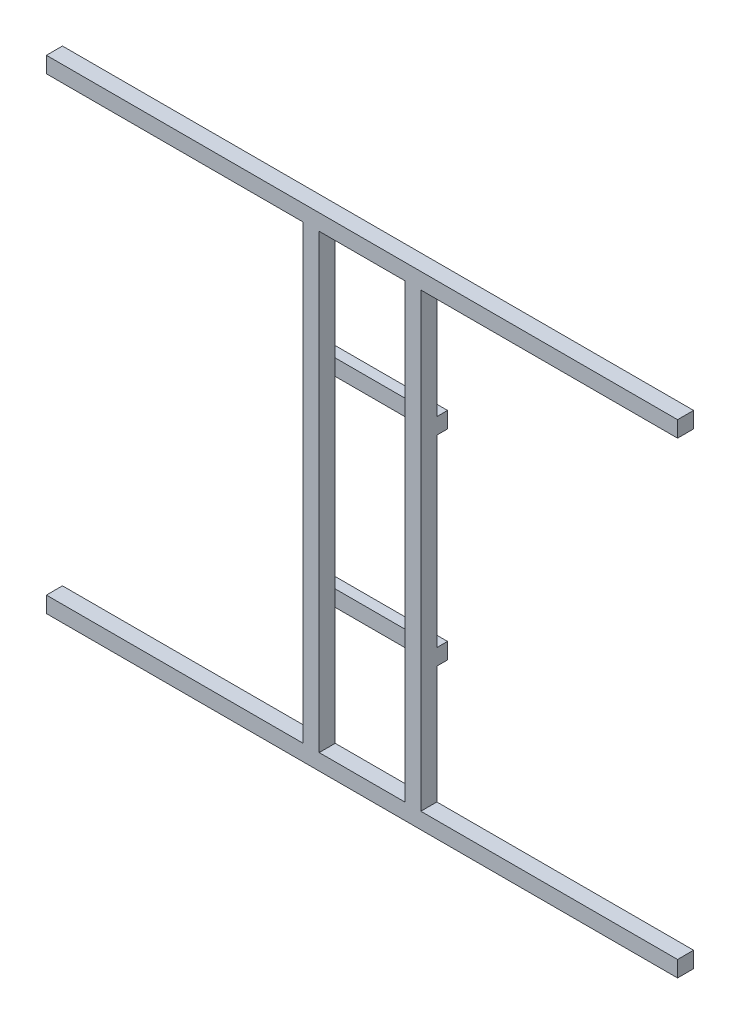
ISO-10303-21;
HEADER;
FILE_DESCRIPTION(('STEP AP214'),'2;1');
FILE_NAME('part.step','',(''),(''),'','','');
FILE_SCHEMA(('AUTOMOTIVE_DESIGN { 1 0 10303 214 1 1 1 1 }'));
ENDSEC;
DATA;
#1=APPLICATION_CONTEXT('core data for automotive mechanical design processes');
#2=APPLICATION_PROTOCOL_DEFINITION('international standard','automotive_design',2000,#1);
#3=PRODUCT_CONTEXT('',#1,'mechanical');
#4=PRODUCT('Part','Part','',(#3));
#5=PRODUCT_RELATED_PRODUCT_CATEGORY('part','',(#4));
#6=PRODUCT_DEFINITION_FORMATION('','',#4);
#7=PRODUCT_DEFINITION_CONTEXT('part definition',#1,'design');
#8=PRODUCT_DEFINITION('design','',#6,#7);
#9=PRODUCT_DEFINITION_SHAPE('','',#8);
#10=(LENGTH_UNIT() NAMED_UNIT(*) SI_UNIT(.MILLI.,.METRE.));
#11=(NAMED_UNIT(*) PLANE_ANGLE_UNIT() SI_UNIT($,.RADIAN.));
#12=(NAMED_UNIT(*) SI_UNIT($,.STERADIAN.) SOLID_ANGLE_UNIT());
#13=UNCERTAINTY_MEASURE_WITH_UNIT(LENGTH_MEASURE(1.E-05),#10,'distance_accuracy_value','');
#14=(GEOMETRIC_REPRESENTATION_CONTEXT(3) GLOBAL_UNCERTAINTY_ASSIGNED_CONTEXT((#13)) GLOBAL_UNIT_ASSIGNED_CONTEXT((#10,
#11,#12)) REPRESENTATION_CONTEXT('',''));
#15=CARTESIAN_POINT('',(0.,0.,0.));
#16=DIRECTION('',(0.,0.,1.));
#17=DIRECTION('',(1.,0.,0.));
#18=AXIS2_PLACEMENT_3D('',#15,#16,#17);
#19=CARTESIAN_POINT('',(0.,0.,10.));
#20=DIRECTION('',(0.,0.,-1.));
#21=DIRECTION('',(-1.,0.,0.));
#22=AXIS2_PLACEMENT_3D('',#19,#20,#21);
#23=PLANE('',#22);
#24=DIRECTION('',(0.,-1.,0.));
#25=VECTOR('',#24,1.);
#26=CARTESIAN_POINT('',(-54.9999999999967,-210.999923245137,10.));
#27=LINE('',#26,#25);
#28=CARTESIAN_POINT('',(-54.9999999999967,-100.999923245137,10.));
#29=VERTEX_POINT('',#28);
#30=CARTESIAN_POINT('',(-54.9999999999967,-210.999923245137,10.));
#31=VERTEX_POINT('',#30);
#32=EDGE_CURVE('E339',#29,#31,#27,.T.);
#33=ORIENTED_EDGE('',*,*,#32,.F.);
#34=DIRECTION('',(1.,0.,0.));
#35=VECTOR('',#34,1.);
#36=CARTESIAN_POINT('',(54.9999999999963,-100.999923245137,10.));
#37=LINE('',#36,#35);
#38=CARTESIAN_POINT('',(-39.9999999999966,-100.999923245137,10.));
#39=VERTEX_POINT('',#38);
#40=EDGE_CURVE('E427',#29,#39,#37,.T.);
#41=ORIENTED_EDGE('',*,*,#40,.T.);
#42=DIRECTION('',(0.,-1.,0.));
#43=VECTOR('',#42,1.);
#44=CARTESIAN_POINT('',(-39.9999999999967,-210.999923245137,10.));
#45=LINE('',#44,#43);
#46=CARTESIAN_POINT('',(-39.9999999999967,-210.999923245137,10.));
#47=VERTEX_POINT('',#46);
#48=EDGE_CURVE('E277',#39,#47,#45,.T.);
#49=ORIENTED_EDGE('',*,*,#48,.T.);
#50=DIRECTION('',(1.,0.,0.));
#51=VECTOR('',#50,1.);
#52=CARTESIAN_POINT('',(-39.9999999999967,-210.999923245137,10.));
#53=LINE('',#52,#51);
#54=CARTESIAN_POINT('',(39.9999999999963,-210.999923245137,10.));
#55=VERTEX_POINT('',#54);
#56=EDGE_CURVE('E281',#47,#55,#53,.T.);
#57=ORIENTED_EDGE('',*,*,#56,.T.);
#58=DIRECTION('',(0.,1.,0.));
#59=VECTOR('',#58,1.);
#60=CARTESIAN_POINT('',(39.9999999999963,-210.999923245137,10.));
#61=LINE('',#60,#59);
#62=CARTESIAN_POINT('',(39.9999999999963,-100.999923245137,10.));
#63=VERTEX_POINT('',#62);
#64=EDGE_CURVE('E46',#55,#63,#61,.T.);
#65=ORIENTED_EDGE('',*,*,#64,.T.);
#66=CARTESIAN_POINT('',(54.9999999999963,-100.999923245137,10.));
#67=VERTEX_POINT('',#66);
#68=EDGE_CURVE('E62',#63,#67,#37,.T.);
#69=ORIENTED_EDGE('',*,*,#68,.T.);
#70=DIRECTION('',(0.,1.,0.));
#71=VECTOR('',#70,1.);
#72=CARTESIAN_POINT('',(54.9999999999963,-210.999923245137,10.));
#73=LINE('',#72,#71);
#74=CARTESIAN_POINT('',(54.9999999999963,-210.999923245137,10.));
#75=VERTEX_POINT('',#74);
#76=EDGE_CURVE('E240',#75,#67,#73,.T.);
#77=ORIENTED_EDGE('',*,*,#76,.F.);
#78=DIRECTION('',(-1.,0.,0.));
#79=VECTOR('',#78,1.);
#80=CARTESIAN_POINT('',(54.9999999999963,-210.999923245137,10.));
#81=LINE('',#80,#79);
#82=CARTESIAN_POINT('',(294.999999999996,-210.999923245137,10.));
#83=VERTEX_POINT('',#82);
#84=EDGE_CURVE('E297',#83,#75,#81,.T.);
#85=ORIENTED_EDGE('',*,*,#84,.F.);
#86=DIRECTION('',(0.,1.,0.));
#87=VECTOR('',#86,1.);
#88=CARTESIAN_POINT('',(294.999999999996,-210.999923245137,10.));
#89=LINE('',#88,#87);
#90=CARTESIAN_POINT('',(294.999999999996,-225.999923245137,10.));
#91=VERTEX_POINT('',#90);
#92=EDGE_CURVE('E302',#91,#83,#89,.T.);
#93=ORIENTED_EDGE('',*,*,#92,.F.);
#94=DIRECTION('',(1.,0.,0.));
#95=VECTOR('',#94,1.);
#96=CARTESIAN_POINT('',(-295.000000000004,-225.999923245137,10.));
#97=LINE('',#96,#95);
#98=CARTESIAN_POINT('',(-295.000000000004,-225.999923245137,10.));
#99=VERTEX_POINT('',#98);
#100=EDGE_CURVE('E348',#99,#91,#97,.T.);
#101=ORIENTED_EDGE('',*,*,#100,.F.);
#102=DIRECTION('',(0.,-1.,0.));
#103=VECTOR('',#102,1.);
#104=CARTESIAN_POINT('',(-295.000000000004,-210.999923245137,10.));
#105=LINE('',#104,#103);
#106=CARTESIAN_POINT('',(-295.000000000004,-210.999923245137,10.));
#107=VERTEX_POINT('',#106);
#108=EDGE_CURVE('E346',#107,#99,#105,.T.);
#109=ORIENTED_EDGE('',*,*,#108,.F.);
#110=DIRECTION('',(-1.,0.,0.));
#111=VECTOR('',#110,1.);
#112=CARTESIAN_POINT('',(-295.000000000004,-210.999923245137,10.));
#113=LINE('',#112,#111);
#114=EDGE_CURVE('E343',#31,#107,#113,.T.);
#115=ORIENTED_EDGE('',*,*,#114,.F.);
#116=EDGE_LOOP('',(#33,#41,#49,#57,#65,#69,#77,#85,#93,#101,#109,#115));
#117=FACE_BOUND('',#116,.T.);
#118=ADVANCED_FACE('F35',(#117),#23,.T.);
#119=CARTESIAN_POINT('',(54.9999999999963,-85.9999232451367,10.));
#120=VERTEX_POINT('',#119);
#121=CARTESIAN_POINT('',(54.9999999999963,85.9999232451366,10.));
#122=VERTEX_POINT('',#121);
#123=EDGE_CURVE('E54',#120,#122,#73,.T.);
#124=ORIENTED_EDGE('',*,*,#123,.F.);
#125=DIRECTION('',(-1.,0.,0.));
#126=VECTOR('',#125,1.);
#127=CARTESIAN_POINT('',(54.9999999999963,-85.9999232451367,10.));
#128=LINE('',#127,#126);
#129=CARTESIAN_POINT('',(39.9999999999963,-85.9999232451367,10.));
#130=VERTEX_POINT('',#129);
#131=EDGE_CURVE('E252',#120,#130,#128,.T.);
#132=ORIENTED_EDGE('',*,*,#131,.T.);
#133=CARTESIAN_POINT('',(39.9999999999963,85.9999232451364,10.));
#134=VERTEX_POINT('',#133);
#135=EDGE_CURVE('E286',#130,#134,#61,.T.);
#136=ORIENTED_EDGE('',*,*,#135,.T.);
#137=DIRECTION('',(1.,0.,0.));
#138=VECTOR('',#137,1.);
#139=CARTESIAN_POINT('',(54.9999999999963,85.9999232451367,10.));
#140=LINE('',#139,#138);
#141=EDGE_CURVE('E389',#134,#122,#140,.T.);
#142=ORIENTED_EDGE('',*,*,#141,.T.);
#143=EDGE_LOOP('',(#124,#132,#136,#142));
#144=FACE_BOUND('',#143,.T.);
#145=ADVANCED_FACE('F453',(#144),#23,.T.);
#146=CARTESIAN_POINT('',(-39.9999999999966,85.9999232451367,10.));
#147=VERTEX_POINT('',#146);
#148=CARTESIAN_POINT('',(-39.9999999999967,-85.9999232451367,10.));
#149=VERTEX_POINT('',#148);
#150=EDGE_CURVE('E282',#147,#149,#45,.T.);
#151=ORIENTED_EDGE('',*,*,#150,.T.);
#152=CARTESIAN_POINT('',(-54.9999999999967,-85.9999232451367,10.));
#153=VERTEX_POINT('',#152);
#154=EDGE_CURVE('E449',#149,#153,#128,.T.);
#155=ORIENTED_EDGE('',*,*,#154,.T.);
#156=CARTESIAN_POINT('',(-54.9999999999967,85.9999232451366,10.));
#157=VERTEX_POINT('',#156);
#158=EDGE_CURVE('E344',#157,#153,#27,.T.);
#159=ORIENTED_EDGE('',*,*,#158,.F.);
#160=EDGE_CURVE('E392',#157,#147,#140,.T.);
#161=ORIENTED_EDGE('',*,*,#160,.T.);
#162=EDGE_LOOP('',(#151,#155,#159,#161));
#163=FACE_BOUND('',#162,.T.);
#164=ADVANCED_FACE('F505',(#163),#23,.T.);
#165=CARTESIAN_POINT('',(54.9999999999963,100.999923245137,10.));
#166=DIRECTION('',(-1.,0.,0.));
#167=DIRECTION('',(0.,0.,1.));
#168=AXIS2_PLACEMENT_3D('',#165,#166,#167);
#169=PLANE('',#168);
#170=DIRECTION('',(0.,1.,0.));
#171=VECTOR('',#170,1.);
#172=CARTESIAN_POINT('',(54.9999999999963,100.999923245137,0.));
#173=LINE('',#172,#171);
#174=CARTESIAN_POINT('',(54.9999999999963,85.9999232451367,0.));
#175=VERTEX_POINT('',#174);
#176=CARTESIAN_POINT('',(54.9999999999963,100.999923245137,0.));
#177=VERTEX_POINT('',#176);
#178=EDGE_CURVE('E385',#175,#177,#173,.T.);
#179=ORIENTED_EDGE('',*,*,#178,.T.);
#180=DIRECTION('',(0.,0.,-1.));
#181=VECTOR('',#180,1.);
#182=CARTESIAN_POINT('',(54.9999999999963,100.999923245137,10.));
#183=LINE('',#182,#181);
#184=CARTESIAN_POINT('',(54.9999999999963,100.999923245137,10.));
#185=VERTEX_POINT('',#184);
#186=EDGE_CURVE('E39',#185,#177,#183,.T.);
#187=ORIENTED_EDGE('',*,*,#186,.F.);
#188=CARTESIAN_POINT('',(54.9999999999963,210.999923245137,10.));
#189=VERTEX_POINT('',#188);
#190=EDGE_CURVE('E327',#185,#189,#73,.T.);
#191=ORIENTED_EDGE('',*,*,#190,.T.);
#192=DIRECTION('',(0.,0.,-1.));
#193=VECTOR('',#192,1.);
#194=CARTESIAN_POINT('',(54.9999999999963,210.999923245137,25.));
#195=LINE('',#194,#193);
#196=CARTESIAN_POINT('',(54.9999999999963,210.999923245137,25.));
#197=VERTEX_POINT('',#196);
#198=EDGE_CURVE('E380',#197,#189,#195,.T.);
#199=ORIENTED_EDGE('',*,*,#198,.F.);
#200=DIRECTION('',(0.,1.,0.));
#201=VECTOR('',#200,1.);
#202=CARTESIAN_POINT('',(54.9999999999963,-210.999923245137,25.));
#203=LINE('',#202,#201);
#204=CARTESIAN_POINT('',(54.9999999999963,-210.999923245137,25.));
#205=VERTEX_POINT('',#204);
#206=EDGE_CURVE('E301',#205,#197,#203,.T.);
#207=ORIENTED_EDGE('',*,*,#206,.F.);
#208=DIRECTION('',(0.,0.,-1.));
#209=VECTOR('',#208,1.);
#210=CARTESIAN_POINT('',(54.9999999999963,-210.999923245137,25.));
#211=LINE('',#210,#209);
#212=EDGE_CURVE('E383',#205,#75,#211,.T.);
#213=ORIENTED_EDGE('',*,*,#212,.T.);
#214=ORIENTED_EDGE('',*,*,#76,.T.);
#215=DIRECTION('',(0.,0.,-1.));
#216=VECTOR('',#215,1.);
#217=CARTESIAN_POINT('',(54.9999999999963,-100.999923245137,10.));
#218=LINE('',#217,#216);
#219=CARTESIAN_POINT('',(54.9999999999963,-100.999923245137,0.));
#220=VERTEX_POINT('',#219);
#221=EDGE_CURVE('E237',#67,#220,#218,.T.);
#222=ORIENTED_EDGE('',*,*,#221,.T.);
#223=DIRECTION('',(0.,1.,0.));
#224=VECTOR('',#223,1.);
#225=CARTESIAN_POINT('',(54.9999999999963,-100.999923245137,0.));
#226=LINE('',#225,#224);
#227=CARTESIAN_POINT('',(54.9999999999963,-85.9999232451367,0.));
#228=VERTEX_POINT('',#227);
#229=EDGE_CURVE('E226',#220,#228,#226,.T.);
#230=ORIENTED_EDGE('',*,*,#229,.T.);
#231=DIRECTION('',(0.,0.,-1.));
#232=VECTOR('',#231,1.);
#233=CARTESIAN_POINT('',(54.9999999999963,-85.9999232451367,10.));
#234=LINE('',#233,#232);
#235=EDGE_CURVE('E243',#120,#228,#234,.T.);
#236=ORIENTED_EDGE('',*,*,#235,.F.);
#237=ORIENTED_EDGE('',*,*,#123,.T.);
#238=DIRECTION('',(0.,0.,-1.));
#239=VECTOR('',#238,1.);
#240=CARTESIAN_POINT('',(54.9999999999963,85.9999232451367,10.));
#241=LINE('',#240,#239);
#242=EDGE_CURVE('E395',#122,#175,#241,.T.);
#243=ORIENTED_EDGE('',*,*,#242,.T.);
#244=EDGE_LOOP('',(#179,#187,#191,#199,#207,#213,#214,#222,#230,#236,#237,#243));
#245=FACE_BOUND('',#244,.T.);
#246=ADVANCED_FACE('F37',(#245),#169,.F.);
#247=CARTESIAN_POINT('',(54.9999999999963,100.999923245137,10.));
#248=DIRECTION('',(0.,-1.,0.));
#249=DIRECTION('',(1.,0.,0.));
#250=AXIS2_PLACEMENT_3D('',#247,#248,#249);
#251=PLANE('',#250);
#252=DIRECTION('',(-1.,0.,0.));
#253=VECTOR('',#252,1.);
#254=CARTESIAN_POINT('',(54.9999999999963,100.999923245137,0.));
#255=LINE('',#254,#253);
#256=CARTESIAN_POINT('',(-54.9999999999966,100.999923245137,0.));
#257=VERTEX_POINT('',#256);
#258=EDGE_CURVE('E398',#177,#257,#255,.T.);
#259=ORIENTED_EDGE('',*,*,#258,.T.);
#260=DIRECTION('',(0.,0.,-1.));
#261=VECTOR('',#260,1.);
#262=CARTESIAN_POINT('',(-54.9999999999966,100.999923245137,10.));
#263=LINE('',#262,#261);
#264=CARTESIAN_POINT('',(-54.9999999999967,100.999923245137,10.));
#265=VERTEX_POINT('',#264);
#266=EDGE_CURVE('E408',#265,#257,#263,.T.);
#267=ORIENTED_EDGE('',*,*,#266,.F.);
#268=DIRECTION('',(-1.,0.,0.));
#269=VECTOR('',#268,1.);
#270=CARTESIAN_POINT('',(54.9999999999963,100.999923245137,10.));
#271=LINE('',#270,#269);
#272=CARTESIAN_POINT('',(-39.9999999999967,100.999923245136,10.));
#273=VERTEX_POINT('',#272);
#274=EDGE_CURVE('E391',#273,#265,#271,.T.);
#275=ORIENTED_EDGE('',*,*,#274,.F.);
#276=CARTESIAN_POINT('',(39.9999999999963,100.999923245137,10.));
#277=VERTEX_POINT('',#276);
#278=EDGE_CURVE('E390',#277,#273,#271,.T.);
#279=ORIENTED_EDGE('',*,*,#278,.F.);
#280=EDGE_CURVE('E386',#185,#277,#271,.T.);
#281=ORIENTED_EDGE('',*,*,#280,.F.);
#282=ORIENTED_EDGE('',*,*,#186,.T.);
#283=EDGE_LOOP('',(#259,#267,#275,#279,#281,#282));
#284=FACE_BOUND('',#283,.T.);
#285=ADVANCED_FACE('F495',(#284),#251,.F.);
#286=CARTESIAN_POINT('',(-54.9999999999966,100.999923245137,10.));
#287=DIRECTION('',(1.,0.,0.));
#288=DIRECTION('',(0.,0.,-1.));
#289=AXIS2_PLACEMENT_3D('',#286,#287,#288);
#290=PLANE('',#289);
#291=DIRECTION('',(0.,-1.,0.));
#292=VECTOR('',#291,1.);
#293=CARTESIAN_POINT('',(-54.9999999999966,100.999923245137,0.));
#294=LINE('',#293,#292);
#295=CARTESIAN_POINT('',(-54.9999999999966,85.9999232451367,0.));
#296=VERTEX_POINT('',#295);
#297=EDGE_CURVE('E400',#257,#296,#294,.T.);
#298=ORIENTED_EDGE('',*,*,#297,.T.);
#299=DIRECTION('',(0.,0.,-1.));
#300=VECTOR('',#299,1.);
#301=CARTESIAN_POINT('',(-54.9999999999966,85.9999232451367,10.));
#302=LINE('',#301,#300);
#303=EDGE_CURVE('E406',#157,#296,#302,.T.);
#304=ORIENTED_EDGE('',*,*,#303,.F.);
#305=ORIENTED_EDGE('',*,*,#158,.T.);
#306=DIRECTION('',(0.,0.,-1.));
#307=VECTOR('',#306,1.);
#308=CARTESIAN_POINT('',(-54.9999999999967,-85.9999232451366,10.));
#309=LINE('',#308,#307);
#310=CARTESIAN_POINT('',(-54.9999999999967,-85.9999232451366,0.));
#311=VERTEX_POINT('',#310);
#312=EDGE_CURVE('E259',#153,#311,#309,.T.);
#313=ORIENTED_EDGE('',*,*,#312,.T.);
#314=DIRECTION('',(0.,-1.,0.));
#315=VECTOR('',#314,1.);
#316=CARTESIAN_POINT('',(-54.9999999999967,-100.999923245137,0.));
#317=LINE('',#316,#315);
#318=CARTESIAN_POINT('',(-54.9999999999967,-100.999923245137,0.));
#319=VERTEX_POINT('',#318);
#320=EDGE_CURVE('E256',#311,#319,#317,.T.);
#321=ORIENTED_EDGE('',*,*,#320,.T.);
#322=DIRECTION('',(0.,0.,-1.));
#323=VECTOR('',#322,1.);
#324=CARTESIAN_POINT('',(-54.9999999999967,-100.999923245137,10.));
#325=LINE('',#324,#323);
#326=EDGE_CURVE('E249',#29,#319,#325,.T.);
#327=ORIENTED_EDGE('',*,*,#326,.F.);
#328=ORIENTED_EDGE('',*,*,#32,.T.);
#329=DIRECTION('',(0.,0.,-1.));
#330=VECTOR('',#329,1.);
#331=CARTESIAN_POINT('',(-54.9999999999967,-210.999923245137,25.));
#332=LINE('',#331,#330);
#333=CARTESIAN_POINT('',(-54.9999999999967,-210.999923245137,25.));
#334=VERTEX_POINT('',#333);
#335=EDGE_CURVE('E362',#334,#31,#332,.T.);
#336=ORIENTED_EDGE('',*,*,#335,.F.);
#337=DIRECTION('',(0.,-1.,0.));
#338=VECTOR('',#337,1.);
#339=CARTESIAN_POINT('',(-54.9999999999967,-210.999923245137,25.));
#340=LINE('',#339,#338);
#341=CARTESIAN_POINT('',(-54.9999999999967,210.999923245137,25.));
#342=VERTEX_POINT('',#341);
#343=EDGE_CURVE('E314',#342,#334,#340,.T.);
#344=ORIENTED_EDGE('',*,*,#343,.F.);
#345=DIRECTION('',(0.,0.,-1.));
#346=VECTOR('',#345,1.);
#347=CARTESIAN_POINT('',(-54.9999999999967,210.999923245137,25.));
#348=LINE('',#347,#346);
#349=CARTESIAN_POINT('',(-54.9999999999967,210.999923245137,10.));
#350=VERTEX_POINT('',#349);
#351=EDGE_CURVE('E365',#342,#350,#348,.T.);
#352=ORIENTED_EDGE('',*,*,#351,.T.);
#353=EDGE_CURVE('E340',#350,#265,#27,.T.);
#354=ORIENTED_EDGE('',*,*,#353,.T.);
#355=ORIENTED_EDGE('',*,*,#266,.T.);
#356=EDGE_LOOP('',(#298,#304,#305,#313,#321,#327,#328,#336,#344,#352,#354,#355));
#357=FACE_BOUND('',#356,.T.);
#358=ADVANCED_FACE('F458',(#357),#290,.F.);
#359=CARTESIAN_POINT('',(54.9999999999963,85.9999232451367,10.));
#360=DIRECTION('',(0.,1.,0.));
#361=DIRECTION('',(-1.,0.,0.));
#362=AXIS2_PLACEMENT_3D('',#359,#360,#361);
#363=PLANE('',#362);
#364=DIRECTION('',(1.,0.,0.));
#365=VECTOR('',#364,1.);
#366=CARTESIAN_POINT('',(54.9999999999963,85.9999232451367,0.));
#367=LINE('',#366,#365);
#368=EDGE_CURVE('E402',#296,#175,#367,.T.);
#369=ORIENTED_EDGE('',*,*,#368,.T.);
#370=ORIENTED_EDGE('',*,*,#242,.F.);
#371=ORIENTED_EDGE('',*,*,#141,.F.);
#372=EDGE_CURVE('E396',#147,#134,#140,.T.);
#373=ORIENTED_EDGE('',*,*,#372,.F.);
#374=ORIENTED_EDGE('',*,*,#160,.F.);
#375=ORIENTED_EDGE('',*,*,#303,.T.);
#376=EDGE_LOOP('',(#369,#370,#371,#373,#374,#375));
#377=FACE_BOUND('',#376,.T.);
#378=ADVANCED_FACE('F503',(#377),#363,.F.);
#379=CARTESIAN_POINT('',(0.,0.,10.));
#380=DIRECTION('',(0.,0.,-1.));
#381=DIRECTION('',(-1.,0.,0.));
#382=AXIS2_PLACEMENT_3D('',#379,#380,#381);
#383=PLANE('',#382);
#384=ORIENTED_EDGE('',*,*,#372,.T.);
#385=EDGE_CURVE('E11',#134,#277,#61,.T.);
#386=ORIENTED_EDGE('',*,*,#385,.T.);
#387=ORIENTED_EDGE('',*,*,#278,.T.);
#388=EDGE_CURVE('E44',#273,#147,#45,.T.);
#389=ORIENTED_EDGE('',*,*,#388,.T.);
#390=EDGE_LOOP('',(#384,#386,#387,#389));
#391=FACE_BOUND('',#390,.T.);
#392=ADVANCED_FACE('F494',(#391),#383,.F.);
#393=CARTESIAN_POINT('',(0.,0.,0.));
#394=DIRECTION('',(0.,0.,-1.));
#395=DIRECTION('',(-1.,0.,0.));
#396=AXIS2_PLACEMENT_3D('',#393,#394,#395);
#397=PLANE('',#396);
#398=ORIENTED_EDGE('',*,*,#178,.F.);
#399=ORIENTED_EDGE('',*,*,#368,.F.);
#400=ORIENTED_EDGE('',*,*,#297,.F.);
#401=ORIENTED_EDGE('',*,*,#258,.F.);
#402=EDGE_LOOP('',(#398,#399,#400,#401));
#403=FACE_BOUND('',#402,.T.);
#404=ADVANCED_FACE('F501',(#403),#397,.T.);
#405=ORIENTED_EDGE('',*,*,#190,.F.);
#406=ORIENTED_EDGE('',*,*,#280,.T.);
#407=CARTESIAN_POINT('',(39.9999999999963,210.999923245137,10.));
#408=VERTEX_POINT('',#407);
#409=EDGE_CURVE('E47',#277,#408,#61,.T.);
#410=ORIENTED_EDGE('',*,*,#409,.T.);
#411=DIRECTION('',(-1.,0.,0.));
#412=VECTOR('',#411,1.);
#413=CARTESIAN_POINT('',(-39.9999999999967,210.999923245137,10.));
#414=LINE('',#413,#412);
#415=CARTESIAN_POINT('',(-39.9999999999967,210.999923245137,10.));
#416=VERTEX_POINT('',#415);
#417=EDGE_CURVE('E264',#408,#416,#414,.T.);
#418=ORIENTED_EDGE('',*,*,#417,.T.);
#419=EDGE_CURVE('E278',#416,#273,#45,.T.);
#420=ORIENTED_EDGE('',*,*,#419,.T.);
#421=ORIENTED_EDGE('',*,*,#274,.T.);
#422=ORIENTED_EDGE('',*,*,#353,.F.);
#423=DIRECTION('',(1.,0.,0.));
#424=VECTOR('',#423,1.);
#425=CARTESIAN_POINT('',(-295.000000000004,210.999923245137,10.));
#426=LINE('',#425,#424);
#427=CARTESIAN_POINT('',(-295.000000000004,210.999923245137,10.));
#428=VERTEX_POINT('',#427);
#429=EDGE_CURVE('E337',#428,#350,#426,.T.);
#430=ORIENTED_EDGE('',*,*,#429,.F.);
#431=DIRECTION('',(0.,-1.,0.));
#432=VECTOR('',#431,1.);
#433=CARTESIAN_POINT('',(-295.000000000004,210.999923245137,10.));
#434=LINE('',#433,#432);
#435=CARTESIAN_POINT('',(-295.000000000004,225.999923245137,10.));
#436=VERTEX_POINT('',#435);
#437=EDGE_CURVE('E335',#436,#428,#434,.T.);
#438=ORIENTED_EDGE('',*,*,#437,.F.);
#439=DIRECTION('',(-1.,0.,0.));
#440=VECTOR('',#439,1.);
#441=CARTESIAN_POINT('',(-295.000000000004,225.999923245137,10.));
#442=LINE('',#441,#440);
#443=CARTESIAN_POINT('',(294.999999999996,225.999923245137,10.));
#444=VERTEX_POINT('',#443);
#445=EDGE_CURVE('E333',#444,#436,#442,.T.);
#446=ORIENTED_EDGE('',*,*,#445,.F.);
#447=DIRECTION('',(0.,1.,0.));
#448=VECTOR('',#447,1.);
#449=CARTESIAN_POINT('',(294.999999999996,210.999923245137,10.));
#450=LINE('',#449,#448);
#451=CARTESIAN_POINT('',(294.999999999996,210.999923245137,10.));
#452=VERTEX_POINT('',#451);
#453=EDGE_CURVE('E331',#452,#444,#450,.T.);
#454=ORIENTED_EDGE('',*,*,#453,.F.);
#455=DIRECTION('',(1.,0.,0.));
#456=VECTOR('',#455,1.);
#457=CARTESIAN_POINT('',(54.9999999999963,210.999923245137,10.));
#458=LINE('',#457,#456);
#459=EDGE_CURVE('E329',#189,#452,#458,.T.);
#460=ORIENTED_EDGE('',*,*,#459,.F.);
#461=EDGE_LOOP('',(#405,#406,#410,#418,#420,#421,#422,#430,#438,#446,#454,#460));
#462=FACE_BOUND('',#461,.T.);
#463=ADVANCED_FACE('F490',(#462),#23,.T.);
#464=CARTESIAN_POINT('',(0.,0.,25.));
#465=DIRECTION('',(0.,0.,-1.));
#466=DIRECTION('',(-1.,0.,0.));
#467=AXIS2_PLACEMENT_3D('',#464,#465,#466);
#468=PLANE('',#467);
#469=DIRECTION('',(-1.,0.,0.));
#470=VECTOR('',#469,1.);
#471=CARTESIAN_POINT('',(54.9999999999963,-210.999923245137,25.));
#472=LINE('',#471,#470);
#473=CARTESIAN_POINT('',(294.999999999996,-210.999923245137,25.));
#474=VERTEX_POINT('',#473);
#475=EDGE_CURVE('E298',#474,#205,#472,.T.);
#476=ORIENTED_EDGE('',*,*,#475,.T.);
#477=ORIENTED_EDGE('',*,*,#206,.T.);
#478=DIRECTION('',(1.,0.,0.));
#479=VECTOR('',#478,1.);
#480=CARTESIAN_POINT('',(54.9999999999963,210.999923245137,25.));
#481=LINE('',#480,#479);
#482=CARTESIAN_POINT('',(294.999999999996,210.999923245137,25.));
#483=VERTEX_POINT('',#482);
#484=EDGE_CURVE('E304',#197,#483,#481,.T.);
#485=ORIENTED_EDGE('',*,*,#484,.T.);
#486=DIRECTION('',(0.,1.,0.));
#487=VECTOR('',#486,1.);
#488=CARTESIAN_POINT('',(294.999999999996,210.999923245137,25.));
#489=LINE('',#488,#487);
#490=CARTESIAN_POINT('',(294.999999999996,225.999923245137,25.));
#491=VERTEX_POINT('',#490);
#492=EDGE_CURVE('E306',#483,#491,#489,.T.);
#493=ORIENTED_EDGE('',*,*,#492,.T.);
#494=DIRECTION('',(-1.,0.,0.));
#495=VECTOR('',#494,1.);
#496=CARTESIAN_POINT('',(-295.000000000004,225.999923245137,25.));
#497=LINE('',#496,#495);
#498=CARTESIAN_POINT('',(-295.000000000004,225.999923245137,25.));
#499=VERTEX_POINT('',#498);
#500=EDGE_CURVE('E308',#491,#499,#497,.T.);
#501=ORIENTED_EDGE('',*,*,#500,.T.);
#502=DIRECTION('',(0.,-1.,0.));
#503=VECTOR('',#502,1.);
#504=CARTESIAN_POINT('',(-295.000000000004,210.999923245137,25.));
#505=LINE('',#504,#503);
#506=CARTESIAN_POINT('',(-295.000000000004,210.999923245137,25.));
#507=VERTEX_POINT('',#506);
#508=EDGE_CURVE('E310',#499,#507,#505,.T.);
#509=ORIENTED_EDGE('',*,*,#508,.T.);
#510=DIRECTION('',(1.,0.,0.));
#511=VECTOR('',#510,1.);
#512=CARTESIAN_POINT('',(-295.000000000004,210.999923245137,25.));
#513=LINE('',#512,#511);
#514=EDGE_CURVE('E312',#507,#342,#513,.T.);
#515=ORIENTED_EDGE('',*,*,#514,.T.);
#516=ORIENTED_EDGE('',*,*,#343,.T.);
#517=DIRECTION('',(-1.,0.,0.));
#518=VECTOR('',#517,1.);
#519=CARTESIAN_POINT('',(-295.000000000004,-210.999923245137,25.));
#520=LINE('',#519,#518);
#521=CARTESIAN_POINT('',(-295.000000000004,-210.999923245137,25.));
#522=VERTEX_POINT('',#521);
#523=EDGE_CURVE('E316',#334,#522,#520,.T.);
#524=ORIENTED_EDGE('',*,*,#523,.T.);
#525=DIRECTION('',(0.,-1.,0.));
#526=VECTOR('',#525,1.);
#527=CARTESIAN_POINT('',(-295.000000000004,-210.999923245137,25.));
#528=LINE('',#527,#526);
#529=CARTESIAN_POINT('',(-295.000000000004,-225.999923245137,25.));
#530=VERTEX_POINT('',#529);
#531=EDGE_CURVE('E318',#522,#530,#528,.T.);
#532=ORIENTED_EDGE('',*,*,#531,.T.);
#533=DIRECTION('',(1.,0.,0.));
#534=VECTOR('',#533,1.);
#535=CARTESIAN_POINT('',(-295.000000000004,-225.999923245137,25.));
#536=LINE('',#535,#534);
#537=CARTESIAN_POINT('',(294.999999999996,-225.999923245137,25.));
#538=VERTEX_POINT('',#537);
#539=EDGE_CURVE('E320',#530,#538,#536,.T.);
#540=ORIENTED_EDGE('',*,*,#539,.T.);
#541=DIRECTION('',(0.,1.,0.));
#542=VECTOR('',#541,1.);
#543=CARTESIAN_POINT('',(294.999999999996,-210.999923245137,25.));
#544=LINE('',#543,#542);
#545=EDGE_CURVE('E322',#538,#474,#544,.T.);
#546=ORIENTED_EDGE('',*,*,#545,.T.);
#547=EDGE_LOOP('',(#476,#477,#485,#493,#501,#509,#515,#516,#524,#532,#540,#546));
#548=FACE_BOUND('',#547,.T.);
#549=DIRECTION('',(-1.,0.,0.));
#550=VECTOR('',#549,1.);
#551=CARTESIAN_POINT('',(-39.9999999999967,210.999923245137,25.));
#552=LINE('',#551,#550);
#553=CARTESIAN_POINT('',(39.9999999999963,210.999923245137,25.));
#554=VERTEX_POINT('',#553);
#555=CARTESIAN_POINT('',(-39.9999999999967,210.999923245137,25.));
#556=VERTEX_POINT('',#555);
#557=EDGE_CURVE('E265',#554,#556,#552,.T.);
#558=ORIENTED_EDGE('',*,*,#557,.F.);
#559=DIRECTION('',(0.,1.,0.));
#560=VECTOR('',#559,1.);
#561=CARTESIAN_POINT('',(39.9999999999963,-210.999923245137,25.));
#562=LINE('',#561,#560);
#563=CARTESIAN_POINT('',(39.9999999999963,-210.999923245137,25.));
#564=VERTEX_POINT('',#563);
#565=EDGE_CURVE('E272',#564,#554,#562,.T.);
#566=ORIENTED_EDGE('',*,*,#565,.F.);
#567=DIRECTION('',(1.,0.,0.));
#568=VECTOR('',#567,1.);
#569=CARTESIAN_POINT('',(-39.9999999999967,-210.999923245137,25.));
#570=LINE('',#569,#568);
#571=CARTESIAN_POINT('',(-39.9999999999967,-210.999923245137,25.));
#572=VERTEX_POINT('',#571);
#573=EDGE_CURVE('E269',#572,#564,#570,.T.);
#574=ORIENTED_EDGE('',*,*,#573,.F.);
#575=DIRECTION('',(0.,-1.,0.));
#576=VECTOR('',#575,1.);
#577=CARTESIAN_POINT('',(-39.9999999999967,-210.999923245137,25.));
#578=LINE('',#577,#576);
#579=EDGE_CURVE('E267',#556,#572,#578,.T.);
#580=ORIENTED_EDGE('',*,*,#579,.F.);
#581=EDGE_LOOP('',(#558,#566,#574,#580));
#582=FACE_BOUND('',#581,.T.);
#583=ADVANCED_FACE('F481',(#548,#582),#468,.F.);
#584=CARTESIAN_POINT('',(54.9999999999963,-210.999923245137,25.));
#585=DIRECTION('',(0.,-1.,0.));
#586=DIRECTION('',(0.,0.,-1.));
#587=AXIS2_PLACEMENT_3D('',#584,#585,#586);
#588=PLANE('',#587);
#589=ORIENTED_EDGE('',*,*,#84,.T.);
#590=ORIENTED_EDGE('',*,*,#212,.F.);
#591=ORIENTED_EDGE('',*,*,#475,.F.);
#592=DIRECTION('',(0.,0.,-1.));
#593=VECTOR('',#592,1.);
#594=CARTESIAN_POINT('',(294.999999999996,-210.999923245137,25.));
#595=LINE('',#594,#593);
#596=EDGE_CURVE('E324',#474,#83,#595,.T.);
#597=ORIENTED_EDGE('',*,*,#596,.T.);
#598=EDGE_LOOP('',(#589,#590,#591,#597));
#599=FACE_BOUND('',#598,.T.);
#600=ADVANCED_FACE('F585',(#599),#588,.F.);
#601=CARTESIAN_POINT('',(54.9999999999963,210.999923245137,25.));
#602=DIRECTION('',(0.,1.,0.));
#603=DIRECTION('',(-1.,0.,0.));
#604=AXIS2_PLACEMENT_3D('',#601,#602,#603);
#605=PLANE('',#604);
#606=ORIENTED_EDGE('',*,*,#459,.T.);
#607=DIRECTION('',(0.,0.,-1.));
#608=VECTOR('',#607,1.);
#609=CARTESIAN_POINT('',(294.999999999996,210.999923245137,25.));
#610=LINE('',#609,#608);
#611=EDGE_CURVE('E377',#483,#452,#610,.T.);
#612=ORIENTED_EDGE('',*,*,#611,.F.);
#613=ORIENTED_EDGE('',*,*,#484,.F.);
#614=ORIENTED_EDGE('',*,*,#198,.T.);
#615=EDGE_LOOP('',(#606,#612,#613,#614));
#616=FACE_BOUND('',#615,.T.);
#617=ADVANCED_FACE('F593',(#616),#605,.F.);
#618=CARTESIAN_POINT('',(294.999999999996,210.999923245137,25.));
#619=DIRECTION('',(-1.,0.,0.));
#620=DIRECTION('',(0.,0.,1.));
#621=AXIS2_PLACEMENT_3D('',#618,#619,#620);
#622=PLANE('',#621);
#623=ORIENTED_EDGE('',*,*,#453,.T.);
#624=DIRECTION('',(0.,0.,-1.));
#625=VECTOR('',#624,1.);
#626=CARTESIAN_POINT('',(294.999999999996,225.999923245137,25.));
#627=LINE('',#626,#625);
#628=EDGE_CURVE('E374',#491,#444,#627,.T.);
#629=ORIENTED_EDGE('',*,*,#628,.F.);
#630=ORIENTED_EDGE('',*,*,#492,.F.);
#631=ORIENTED_EDGE('',*,*,#611,.T.);
#632=EDGE_LOOP('',(#623,#629,#630,#631));
#633=FACE_BOUND('',#632,.T.);
#634=ADVANCED_FACE('F603',(#633),#622,.F.);
#635=CARTESIAN_POINT('',(-295.000000000004,225.999923245137,25.));
#636=DIRECTION('',(0.,-1.,0.));
#637=DIRECTION('',(0.,0.,-1.));
#638=AXIS2_PLACEMENT_3D('',#635,#636,#637);
#639=PLANE('',#638);
#640=ORIENTED_EDGE('',*,*,#445,.T.);
#641=DIRECTION('',(0.,0.,-1.));
#642=VECTOR('',#641,1.);
#643=CARTESIAN_POINT('',(-295.000000000004,225.999923245137,25.));
#644=LINE('',#643,#642);
#645=EDGE_CURVE('E371',#499,#436,#644,.T.);
#646=ORIENTED_EDGE('',*,*,#645,.F.);
#647=ORIENTED_EDGE('',*,*,#500,.F.);
#648=ORIENTED_EDGE('',*,*,#628,.T.);
#649=EDGE_LOOP('',(#640,#646,#647,#648));
#650=FACE_BOUND('',#649,.T.);
#651=ADVANCED_FACE('F613',(#650),#639,.F.);
#652=CARTESIAN_POINT('',(-295.000000000004,210.999923245137,25.));
#653=DIRECTION('',(1.,0.,0.));
#654=DIRECTION('',(0.,0.,-1.));
#655=AXIS2_PLACEMENT_3D('',#652,#653,#654);
#656=PLANE('',#655);
#657=ORIENTED_EDGE('',*,*,#437,.T.);
#658=DIRECTION('',(0.,0.,-1.));
#659=VECTOR('',#658,1.);
#660=CARTESIAN_POINT('',(-295.000000000004,210.999923245137,25.));
#661=LINE('',#660,#659);
#662=EDGE_CURVE('E368',#507,#428,#661,.T.);
#663=ORIENTED_EDGE('',*,*,#662,.F.);
#664=ORIENTED_EDGE('',*,*,#508,.F.);
#665=ORIENTED_EDGE('',*,*,#645,.T.);
#666=EDGE_LOOP('',(#657,#663,#664,#665));
#667=FACE_BOUND('',#666,.T.);
#668=ADVANCED_FACE('F623',(#667),#656,.F.);
#669=CARTESIAN_POINT('',(-295.000000000004,210.999923245137,25.));
#670=DIRECTION('',(0.,1.,0.));
#671=DIRECTION('',(0.,0.,1.));
#672=AXIS2_PLACEMENT_3D('',#669,#670,#671);
#673=PLANE('',#672);
#674=ORIENTED_EDGE('',*,*,#429,.T.);
#675=ORIENTED_EDGE('',*,*,#351,.F.);
#676=ORIENTED_EDGE('',*,*,#514,.F.);
#677=ORIENTED_EDGE('',*,*,#662,.T.);
#678=EDGE_LOOP('',(#674,#675,#676,#677));
#679=FACE_BOUND('',#678,.T.);
#680=ADVANCED_FACE('F633',(#679),#673,.F.);
#681=CARTESIAN_POINT('',(-295.000000000004,-210.999923245137,25.));
#682=DIRECTION('',(0.,-1.,0.));
#683=DIRECTION('',(0.,0.,-1.));
#684=AXIS2_PLACEMENT_3D('',#681,#682,#683);
#685=PLANE('',#684);
#686=ORIENTED_EDGE('',*,*,#114,.T.);
#687=DIRECTION('',(0.,0.,-1.));
#688=VECTOR('',#687,1.);
#689=CARTESIAN_POINT('',(-295.000000000004,-210.999923245137,25.));
#690=LINE('',#689,#688);
#691=EDGE_CURVE('E359',#522,#107,#690,.T.);
#692=ORIENTED_EDGE('',*,*,#691,.F.);
#693=ORIENTED_EDGE('',*,*,#523,.F.);
#694=ORIENTED_EDGE('',*,*,#335,.T.);
#695=EDGE_LOOP('',(#686,#692,#693,#694));
#696=FACE_BOUND('',#695,.T.);
#697=ADVANCED_FACE('F466',(#696),#685,.F.);
#698=CARTESIAN_POINT('',(-295.000000000004,-210.999923245137,25.));
#699=DIRECTION('',(1.,0.,0.));
#700=DIRECTION('',(0.,0.,-1.));
#701=AXIS2_PLACEMENT_3D('',#698,#699,#700);
#702=PLANE('',#701);
#703=ORIENTED_EDGE('',*,*,#108,.T.);
#704=DIRECTION('',(0.,0.,-1.));
#705=VECTOR('',#704,1.);
#706=CARTESIAN_POINT('',(-295.000000000004,-225.999923245137,25.));
#707=LINE('',#706,#705);
#708=EDGE_CURVE('E356',#530,#99,#707,.T.);
#709=ORIENTED_EDGE('',*,*,#708,.F.);
#710=ORIENTED_EDGE('',*,*,#531,.F.);
#711=ORIENTED_EDGE('',*,*,#691,.T.);
#712=EDGE_LOOP('',(#703,#709,#710,#711));
#713=FACE_BOUND('',#712,.T.);
#714=ADVANCED_FACE('F473',(#713),#702,.F.);
#715=CARTESIAN_POINT('',(-295.000000000004,-225.999923245137,25.));
#716=DIRECTION('',(0.,1.,0.));
#717=DIRECTION('',(0.,0.,1.));
#718=AXIS2_PLACEMENT_3D('',#715,#716,#717);
#719=PLANE('',#718);
#720=ORIENTED_EDGE('',*,*,#100,.T.);
#721=DIRECTION('',(0.,0.,-1.));
#722=VECTOR('',#721,1.);
#723=CARTESIAN_POINT('',(294.999999999996,-225.999923245137,25.));
#724=LINE('',#723,#722);
#725=EDGE_CURVE('E353',#538,#91,#724,.T.);
#726=ORIENTED_EDGE('',*,*,#725,.F.);
#727=ORIENTED_EDGE('',*,*,#539,.F.);
#728=ORIENTED_EDGE('',*,*,#708,.T.);
#729=EDGE_LOOP('',(#720,#726,#727,#728));
#730=FACE_BOUND('',#729,.T.);
#731=ADVANCED_FACE('F477',(#730),#719,.F.);
#732=CARTESIAN_POINT('',(294.999999999996,-210.999923245137,25.));
#733=DIRECTION('',(-1.,0.,0.));
#734=DIRECTION('',(0.,0.,1.));
#735=AXIS2_PLACEMENT_3D('',#732,#733,#734);
#736=PLANE('',#735);
#737=ORIENTED_EDGE('',*,*,#92,.T.);
#738=ORIENTED_EDGE('',*,*,#596,.F.);
#739=ORIENTED_EDGE('',*,*,#545,.F.);
#740=ORIENTED_EDGE('',*,*,#725,.T.);
#741=EDGE_LOOP('',(#737,#738,#739,#740));
#742=FACE_BOUND('',#741,.T.);
#743=ADVANCED_FACE('F667',(#742),#736,.F.);
#744=CARTESIAN_POINT('',(-39.9999999999967,210.999923245137,25.));
#745=DIRECTION('',(0.,-1.,0.));
#746=DIRECTION('',(0.,0.,-1.));
#747=AXIS2_PLACEMENT_3D('',#744,#745,#746);
#748=PLANE('',#747);
#749=ORIENTED_EDGE('',*,*,#417,.F.);
#750=DIRECTION('',(0.,0.,-1.));
#751=VECTOR('',#750,1.);
#752=CARTESIAN_POINT('',(39.9999999999963,210.999923245137,25.));
#753=LINE('',#752,#751);
#754=EDGE_CURVE('E274',#554,#408,#753,.T.);
#755=ORIENTED_EDGE('',*,*,#754,.F.);
#756=ORIENTED_EDGE('',*,*,#557,.T.);
#757=DIRECTION('',(0.,0.,-1.));
#758=VECTOR('',#757,1.);
#759=CARTESIAN_POINT('',(-39.9999999999967,210.999923245137,25.));
#760=LINE('',#759,#758);
#761=EDGE_CURVE('E294',#556,#416,#760,.T.);
#762=ORIENTED_EDGE('',*,*,#761,.T.);
#763=EDGE_LOOP('',(#749,#755,#756,#762));
#764=FACE_BOUND('',#763,.T.);
#765=ADVANCED_FACE('F676',(#764),#748,.T.);
#766=CARTESIAN_POINT('',(-39.9999999999967,-210.999923245137,25.));
#767=DIRECTION('',(1.,0.,0.));
#768=DIRECTION('',(0.,0.,-1.));
#769=AXIS2_PLACEMENT_3D('',#766,#767,#768);
#770=PLANE('',#769);
#771=ORIENTED_EDGE('',*,*,#419,.F.);
#772=ORIENTED_EDGE('',*,*,#761,.F.);
#773=ORIENTED_EDGE('',*,*,#579,.T.);
#774=DIRECTION('',(0.,0.,-1.));
#775=VECTOR('',#774,1.);
#776=CARTESIAN_POINT('',(-39.9999999999967,-210.999923245137,25.));
#777=LINE('',#776,#775);
#778=EDGE_CURVE('E291',#572,#47,#777,.T.);
#779=ORIENTED_EDGE('',*,*,#778,.T.);
#780=ORIENTED_EDGE('',*,*,#48,.F.);
#781=DIRECTION('',(0.,1.,0.));
#782=VECTOR('',#781,1.);
#783=CARTESIAN_POINT('',(-39.9999999999967,-210.999923245137,10.));
#784=LINE('',#783,#782);
#785=EDGE_CURVE('E242',#39,#149,#784,.T.);
#786=ORIENTED_EDGE('',*,*,#785,.T.);
#787=ORIENTED_EDGE('',*,*,#150,.F.);
#788=ORIENTED_EDGE('',*,*,#388,.F.);
#789=EDGE_LOOP('',(#771,#772,#773,#779,#780,#786,#787,#788));
#790=FACE_BOUND('',#789,.T.);
#791=ADVANCED_FACE('F431',(#790),#770,.T.);
#792=CARTESIAN_POINT('',(-39.9999999999967,-210.999923245137,25.));
#793=DIRECTION('',(0.,1.,0.));
#794=DIRECTION('',(0.,0.,1.));
#795=AXIS2_PLACEMENT_3D('',#792,#793,#794);
#796=PLANE('',#795);
#797=ORIENTED_EDGE('',*,*,#56,.F.);
#798=ORIENTED_EDGE('',*,*,#778,.F.);
#799=ORIENTED_EDGE('',*,*,#573,.T.);
#800=DIRECTION('',(0.,0.,-1.));
#801=VECTOR('',#800,1.);
#802=CARTESIAN_POINT('',(39.9999999999963,-210.999923245137,25.));
#803=LINE('',#802,#801);
#804=EDGE_CURVE('E289',#564,#55,#803,.T.);
#805=ORIENTED_EDGE('',*,*,#804,.T.);
#806=EDGE_LOOP('',(#797,#798,#799,#805));
#807=FACE_BOUND('',#806,.T.);
#808=ADVANCED_FACE('F436',(#807),#796,.T.);
#809=CARTESIAN_POINT('',(39.9999999999963,-210.999923245137,25.));
#810=DIRECTION('',(-1.,0.,0.));
#811=DIRECTION('',(0.,0.,1.));
#812=AXIS2_PLACEMENT_3D('',#809,#810,#811);
#813=PLANE('',#812);
#814=ORIENTED_EDGE('',*,*,#64,.F.);
#815=ORIENTED_EDGE('',*,*,#804,.F.);
#816=ORIENTED_EDGE('',*,*,#565,.T.);
#817=ORIENTED_EDGE('',*,*,#754,.T.);
#818=ORIENTED_EDGE('',*,*,#409,.F.);
#819=ORIENTED_EDGE('',*,*,#385,.F.);
#820=ORIENTED_EDGE('',*,*,#135,.F.);
#821=EDGE_CURVE('E285',#63,#130,#61,.T.);
#822=ORIENTED_EDGE('',*,*,#821,.F.);
#823=EDGE_LOOP('',(#814,#815,#816,#817,#818,#819,#820,#822));
#824=FACE_BOUND('',#823,.T.);
#825=ADVANCED_FACE('F440',(#824),#813,.T.);
#826=CARTESIAN_POINT('',(54.9999999999963,-100.999923245137,10.));
#827=DIRECTION('',(0.,1.,0.));
#828=DIRECTION('',(-1.,0.,0.));
#829=AXIS2_PLACEMENT_3D('',#826,#827,#828);
#830=PLANE('',#829);
#831=DIRECTION('',(1.,0.,0.));
#832=VECTOR('',#831,1.);
#833=CARTESIAN_POINT('',(54.9999999999963,-100.999923245137,0.));
#834=LINE('',#833,#832);
#835=EDGE_CURVE('E231',#319,#220,#834,.T.);
#836=ORIENTED_EDGE('',*,*,#835,.T.);
#837=ORIENTED_EDGE('',*,*,#221,.F.);
#838=ORIENTED_EDGE('',*,*,#68,.F.);
#839=EDGE_CURVE('E444',#39,#63,#37,.T.);
#840=ORIENTED_EDGE('',*,*,#839,.F.);
#841=ORIENTED_EDGE('',*,*,#40,.F.);
#842=ORIENTED_EDGE('',*,*,#326,.T.);
#843=EDGE_LOOP('',(#836,#837,#838,#840,#841,#842));
#844=FACE_BOUND('',#843,.T.);
#845=ADVANCED_FACE('F246',(#844),#830,.F.);
#846=CARTESIAN_POINT('',(54.9999999999963,-85.9999232451367,10.));
#847=DIRECTION('',(0.,-1.,0.));
#848=DIRECTION('',(1.,0.,0.));
#849=AXIS2_PLACEMENT_3D('',#846,#847,#848);
#850=PLANE('',#849);
#851=DIRECTION('',(-1.,0.,0.));
#852=VECTOR('',#851,1.);
#853=CARTESIAN_POINT('',(54.9999999999963,-85.9999232451367,0.));
#854=LINE('',#853,#852);
#855=EDGE_CURVE('E232',#228,#311,#854,.T.);
#856=ORIENTED_EDGE('',*,*,#855,.T.);
#857=ORIENTED_EDGE('',*,*,#312,.F.);
#858=ORIENTED_EDGE('',*,*,#154,.F.);
#859=EDGE_CURVE('E450',#130,#149,#128,.T.);
#860=ORIENTED_EDGE('',*,*,#859,.F.);
#861=ORIENTED_EDGE('',*,*,#131,.F.);
#862=ORIENTED_EDGE('',*,*,#235,.T.);
#863=EDGE_LOOP('',(#856,#857,#858,#860,#861,#862));
#864=FACE_BOUND('',#863,.T.);
#865=ADVANCED_FACE('F456',(#864),#850,.F.);
#866=CARTESIAN_POINT('',(0.,0.,10.));
#867=DIRECTION('',(0.,0.,-1.));
#868=DIRECTION('',(-1.,0.,0.));
#869=AXIS2_PLACEMENT_3D('',#866,#867,#868);
#870=PLANE('',#869);
#871=ORIENTED_EDGE('',*,*,#785,.F.);
#872=ORIENTED_EDGE('',*,*,#839,.T.);
#873=ORIENTED_EDGE('',*,*,#821,.T.);
#874=ORIENTED_EDGE('',*,*,#859,.T.);
#875=EDGE_LOOP('',(#871,#872,#873,#874));
#876=FACE_BOUND('',#875,.T.);
#877=ADVANCED_FACE('F446',(#876),#870,.F.);
#878=CARTESIAN_POINT('',(0.,0.,0.));
#879=DIRECTION('',(0.,0.,-1.));
#880=DIRECTION('',(-1.,0.,0.));
#881=AXIS2_PLACEMENT_3D('',#878,#879,#880);
#882=PLANE('',#881);
#883=ORIENTED_EDGE('',*,*,#835,.F.);
#884=ORIENTED_EDGE('',*,*,#320,.F.);
#885=ORIENTED_EDGE('',*,*,#855,.F.);
#886=ORIENTED_EDGE('',*,*,#229,.F.);
#887=EDGE_LOOP('',(#883,#884,#885,#886));
#888=FACE_BOUND('',#887,.T.);
#889=ADVANCED_FACE('F228',(#888),#882,.T.);
#890=CLOSED_SHELL('',(#118,#145,#164,#246,#285,#358,#378,#392,#404,#463,#583,#600,#617,#634,
#651,#668,#680,#697,#714,#731,#743,#765,#791,#808,#825,#845,#865,#877,#889));
#891=MANIFOLD_SOLID_BREP('B2',#890);
#892=ADVANCED_BREP_SHAPE_REPRESENTATION('',(#18,#891),#14);
#893=SHAPE_DEFINITION_REPRESENTATION(#9,#892);
ENDSEC;
END-ISO-10303-21;
